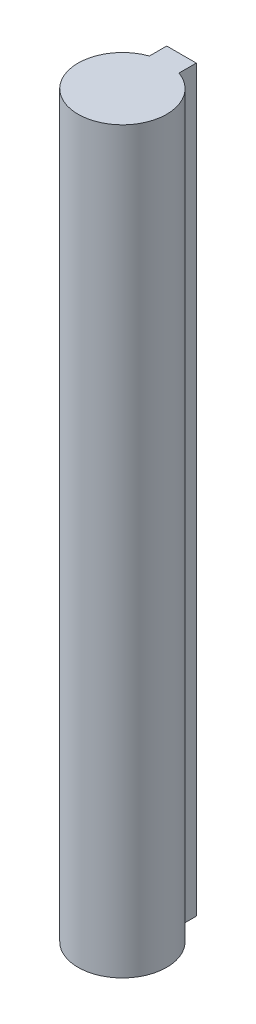
ISO-10303-21;
HEADER;
FILE_DESCRIPTION(('STEP AP214'),'2;1');
FILE_NAME('part.step','',(''),(''),'','','');
FILE_SCHEMA(('AUTOMOTIVE_DESIGN { 1 0 10303 214 1 1 1 1 }'));
ENDSEC;
DATA;
#1=APPLICATION_CONTEXT('core data for automotive mechanical design processes');
#2=APPLICATION_PROTOCOL_DEFINITION('international standard','automotive_design',2000,#1);
#3=PRODUCT_CONTEXT('',#1,'mechanical');
#4=PRODUCT('Part','Part','',(#3));
#5=PRODUCT_RELATED_PRODUCT_CATEGORY('part','',(#4));
#6=PRODUCT_DEFINITION_FORMATION('','',#4);
#7=PRODUCT_DEFINITION_CONTEXT('part definition',#1,'design');
#8=PRODUCT_DEFINITION('design','',#6,#7);
#9=PRODUCT_DEFINITION_SHAPE('','',#8);
#10=(LENGTH_UNIT() NAMED_UNIT(*) SI_UNIT(.MILLI.,.METRE.));
#11=(NAMED_UNIT(*) PLANE_ANGLE_UNIT() SI_UNIT($,.RADIAN.));
#12=(NAMED_UNIT(*) SI_UNIT($,.STERADIAN.) SOLID_ANGLE_UNIT());
#13=UNCERTAINTY_MEASURE_WITH_UNIT(LENGTH_MEASURE(1.E-05),#10,'distance_accuracy_value','');
#14=(GEOMETRIC_REPRESENTATION_CONTEXT(3) GLOBAL_UNCERTAINTY_ASSIGNED_CONTEXT((#13)) GLOBAL_UNIT_ASSIGNED_CONTEXT((#10,
#11,#12)) REPRESENTATION_CONTEXT('',''));
#15=CARTESIAN_POINT('',(0.,0.,0.));
#16=DIRECTION('',(0.,0.,1.));
#17=DIRECTION('',(1.,0.,0.));
#18=AXIS2_PLACEMENT_3D('',#15,#16,#17);
#19=CARTESIAN_POINT('',(0.,50.,0.));
#20=DIRECTION('',(0.,-1.,0.));
#21=DIRECTION('',(0.,0.,-1.));
#22=AXIS2_PLACEMENT_3D('',#19,#20,#21);
#23=CYLINDRICAL_SURFACE('',#22,3.);
#24=DIRECTION('',(0.,-1.,0.));
#25=VECTOR('',#24,1.);
#26=CARTESIAN_POINT('',(1.,50.,-2.82842712474619));
#27=LINE('',#26,#25);
#28=CARTESIAN_POINT('',(1.,50.,-2.82842712474619));
#29=VERTEX_POINT('',#28);
#30=CARTESIAN_POINT('',(1.,0.,-2.82842712474619));
#31=VERTEX_POINT('',#30);
#32=EDGE_CURVE('E56',#29,#31,#27,.T.);
#33=ORIENTED_EDGE('',*,*,#32,.F.);
#34=CARTESIAN_POINT('',(0.,50.,0.));
#35=DIRECTION('',(0.,1.,0.));
#36=DIRECTION('',(0.,0.,1.));
#37=AXIS2_PLACEMENT_3D('',#34,#35,#36);
#38=CIRCLE('',#37,3.);
#39=CARTESIAN_POINT('',(-1.,50.,-2.82842712474619));
#40=VERTEX_POINT('',#39);
#41=EDGE_CURVE('E11',#40,#29,#38,.T.);
#42=ORIENTED_EDGE('',*,*,#41,.F.);
#43=DIRECTION('',(0.,-1.,0.));
#44=VECTOR('',#43,1.);
#45=CARTESIAN_POINT('',(-1.,50.,-2.82842712474619));
#46=LINE('',#45,#44);
#47=CARTESIAN_POINT('',(-1.,0.,-2.82842712474619));
#48=VERTEX_POINT('',#47);
#49=EDGE_CURVE('E97',#48,#40,#46,.F.);
#50=ORIENTED_EDGE('',*,*,#49,.F.);
#51=CARTESIAN_POINT('',(0.,0.,0.));
#52=DIRECTION('',(0.,1.,0.));
#53=DIRECTION('',(0.,0.,1.));
#54=AXIS2_PLACEMENT_3D('',#51,#52,#53);
#55=CIRCLE('',#54,3.);
#56=EDGE_CURVE('E38',#48,#31,#55,.T.);
#57=ORIENTED_EDGE('',*,*,#56,.T.);
#58=EDGE_LOOP('',(#33,#42,#50,#57));
#59=FACE_BOUND('',#58,.T.);
#60=ADVANCED_FACE('F35',(#59),#23,.T.);
#61=CARTESIAN_POINT('',(0.,50.,0.));
#62=DIRECTION('',(0.,1.,0.));
#63=DIRECTION('',(0.,0.,1.));
#64=AXIS2_PLACEMENT_3D('',#61,#62,#63);
#65=PLANE('',#64);
#66=ORIENTED_EDGE('',*,*,#41,.T.);
#67=DIRECTION('',(0.,0.,-1.));
#68=VECTOR('',#67,1.);
#69=CARTESIAN_POINT('',(1.,50.,-4.));
#70=LINE('',#69,#68);
#71=CARTESIAN_POINT('',(1.,50.,-4.));
#72=VERTEX_POINT('',#71);
#73=EDGE_CURVE('E72',#29,#72,#70,.T.);
#74=ORIENTED_EDGE('',*,*,#73,.T.);
#75=DIRECTION('',(-1.,0.,0.));
#76=VECTOR('',#75,1.);
#77=CARTESIAN_POINT('',(-1.,50.,-4.));
#78=LINE('',#77,#76);
#79=CARTESIAN_POINT('',(-1.,50.,-4.));
#80=VERTEX_POINT('',#79);
#81=EDGE_CURVE('E75',#72,#80,#78,.T.);
#82=ORIENTED_EDGE('',*,*,#81,.T.);
#83=DIRECTION('',(0.,0.,1.));
#84=VECTOR('',#83,1.);
#85=CARTESIAN_POINT('',(-1.,50.,-4.));
#86=LINE('',#85,#84);
#87=EDGE_CURVE('E48',#80,#40,#86,.T.);
#88=ORIENTED_EDGE('',*,*,#87,.T.);
#89=EDGE_LOOP('',(#66,#74,#82,#88));
#90=FACE_BOUND('',#89,.T.);
#91=ADVANCED_FACE('F74',(#90),#65,.T.);
#92=CARTESIAN_POINT('',(0.,0.,0.));
#93=DIRECTION('',(0.,1.,0.));
#94=DIRECTION('',(0.,0.,1.));
#95=AXIS2_PLACEMENT_3D('',#92,#93,#94);
#96=PLANE('',#95);
#97=ORIENTED_EDGE('',*,*,#56,.F.);
#98=DIRECTION('',(0.,0.,1.));
#99=VECTOR('',#98,1.);
#100=CARTESIAN_POINT('',(-1.,0.,-4.));
#101=LINE('',#100,#99);
#102=CARTESIAN_POINT('',(-1.,0.,-4.));
#103=VERTEX_POINT('',#102);
#104=EDGE_CURVE('E78',#103,#48,#101,.T.);
#105=ORIENTED_EDGE('',*,*,#104,.F.);
#106=DIRECTION('',(-1.,0.,0.));
#107=VECTOR('',#106,1.);
#108=CARTESIAN_POINT('',(-1.,0.,-4.));
#109=LINE('',#108,#107);
#110=CARTESIAN_POINT('',(1.,0.,-4.));
#111=VERTEX_POINT('',#110);
#112=EDGE_CURVE('E91',#111,#103,#109,.T.);
#113=ORIENTED_EDGE('',*,*,#112,.F.);
#114=DIRECTION('',(0.,0.,-1.));
#115=VECTOR('',#114,1.);
#116=CARTESIAN_POINT('',(1.,0.,-4.));
#117=LINE('',#116,#115);
#118=EDGE_CURVE('E90',#31,#111,#117,.T.);
#119=ORIENTED_EDGE('',*,*,#118,.F.);
#120=EDGE_LOOP('',(#97,#105,#113,#119));
#121=FACE_BOUND('',#120,.T.);
#122=ADVANCED_FACE('F105',(#121),#96,.F.);
#123=CARTESIAN_POINT('',(1.,52.8284271247462,-4.));
#124=DIRECTION('',(-1.,0.,0.));
#125=DIRECTION('',(0.,0.,1.));
#126=AXIS2_PLACEMENT_3D('',#123,#124,#125);
#127=PLANE('',#126);
#128=ORIENTED_EDGE('',*,*,#73,.F.);
#129=ORIENTED_EDGE('',*,*,#32,.T.);
#130=ORIENTED_EDGE('',*,*,#118,.T.);
#131=DIRECTION('',(0.,-1.,0.));
#132=VECTOR('',#131,1.);
#133=CARTESIAN_POINT('',(1.,52.8284271247462,-4.));
#134=LINE('',#133,#132);
#135=EDGE_CURVE('E85',#72,#111,#134,.T.);
#136=ORIENTED_EDGE('',*,*,#135,.F.);
#137=EDGE_LOOP('',(#128,#129,#130,#136));
#138=FACE_BOUND('',#137,.T.);
#139=ADVANCED_FACE('F89',(#138),#127,.F.);
#140=CARTESIAN_POINT('',(-1.,52.8284271247462,-4.));
#141=DIRECTION('',(1.,0.,0.));
#142=DIRECTION('',(0.,0.,-1.));
#143=AXIS2_PLACEMENT_3D('',#140,#141,#142);
#144=PLANE('',#143);
#145=ORIENTED_EDGE('',*,*,#104,.T.);
#146=ORIENTED_EDGE('',*,*,#49,.T.);
#147=ORIENTED_EDGE('',*,*,#87,.F.);
#148=DIRECTION('',(0.,-1.,0.));
#149=VECTOR('',#148,1.);
#150=CARTESIAN_POINT('',(-1.,52.8284271247462,-4.));
#151=LINE('',#150,#149);
#152=EDGE_CURVE('E87',#80,#103,#151,.T.);
#153=ORIENTED_EDGE('',*,*,#152,.T.);
#154=EDGE_LOOP('',(#145,#146,#147,#153));
#155=FACE_BOUND('',#154,.T.);
#156=ADVANCED_FACE('F109',(#155),#144,.F.);
#157=CARTESIAN_POINT('',(-1.,52.8284271247462,-4.));
#158=DIRECTION('',(0.,0.,1.));
#159=DIRECTION('',(1.,0.,0.));
#160=AXIS2_PLACEMENT_3D('',#157,#158,#159);
#161=PLANE('',#160);
#162=ORIENTED_EDGE('',*,*,#81,.F.);
#163=ORIENTED_EDGE('',*,*,#135,.T.);
#164=ORIENTED_EDGE('',*,*,#112,.T.);
#165=ORIENTED_EDGE('',*,*,#152,.F.);
#166=EDGE_LOOP('',(#162,#163,#164,#165));
#167=FACE_BOUND('',#166,.T.);
#168=ADVANCED_FACE('F83',(#167),#161,.F.);
#169=CLOSED_SHELL('',(#60,#91,#122,#139,#156,#168));
#170=MANIFOLD_SOLID_BREP('B2',#169);
#171=ADVANCED_BREP_SHAPE_REPRESENTATION('',(#18,#170),#14);
#172=SHAPE_DEFINITION_REPRESENTATION(#9,#171);
ENDSEC;
END-ISO-10303-21;
